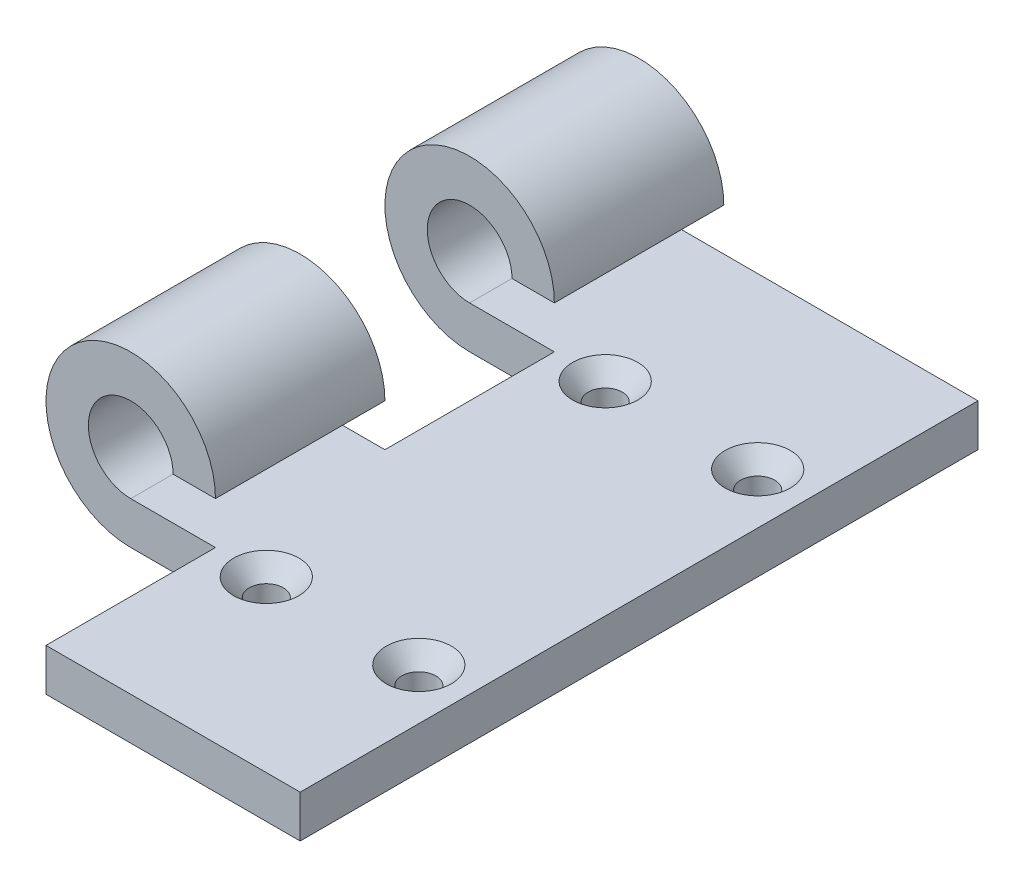
ISO-10303-21;
HEADER;
FILE_DESCRIPTION(('STEP AP214'),'2;1');
FILE_NAME('part.step','',(''),(''),'','','');
FILE_SCHEMA(('AUTOMOTIVE_DESIGN { 1 0 10303 214 1 1 1 1 }'));
ENDSEC;
DATA;
#1=APPLICATION_CONTEXT('core data for automotive mechanical design processes');
#2=APPLICATION_PROTOCOL_DEFINITION('international standard','automotive_design',2000,#1);
#3=PRODUCT_CONTEXT('',#1,'mechanical');
#4=PRODUCT('Part','Part','',(#3));
#5=PRODUCT_RELATED_PRODUCT_CATEGORY('part','',(#4));
#6=PRODUCT_DEFINITION_FORMATION('','',#4);
#7=PRODUCT_DEFINITION_CONTEXT('part definition',#1,'design');
#8=PRODUCT_DEFINITION('design','',#6,#7);
#9=PRODUCT_DEFINITION_SHAPE('','',#8);
#10=(LENGTH_UNIT() NAMED_UNIT(*) SI_UNIT(.MILLI.,.METRE.));
#11=(NAMED_UNIT(*) PLANE_ANGLE_UNIT() SI_UNIT($,.RADIAN.));
#12=(NAMED_UNIT(*) SI_UNIT($,.STERADIAN.) SOLID_ANGLE_UNIT());
#13=UNCERTAINTY_MEASURE_WITH_UNIT(LENGTH_MEASURE(1.E-05),#10,'distance_accuracy_value','');
#14=(GEOMETRIC_REPRESENTATION_CONTEXT(3) GLOBAL_UNCERTAINTY_ASSIGNED_CONTEXT((#13)) GLOBAL_UNIT_ASSIGNED_CONTEXT((#10,
#11,#12)) REPRESENTATION_CONTEXT('',''));
#15=CARTESIAN_POINT('',(0.,0.,0.));
#16=DIRECTION('',(0.,0.,1.));
#17=DIRECTION('',(1.,0.,0.));
#18=AXIS2_PLACEMENT_3D('',#15,#16,#17);
#19=CARTESIAN_POINT('',(-7.62,6.35,25.4));
#20=DIRECTION('',(0.,1.,0.));
#21=DIRECTION('',(0.,0.,1.));
#22=AXIS2_PLACEMENT_3D('',#19,#20,#21);
#23=CONICAL_SURFACE('',#22,4.8895,0.715584993317677);
#24=CARTESIAN_POINT('',(-7.62,3.66181910600595,25.4));
#25=DIRECTION('',(0.,1.,0.));
#26=DIRECTION('',(0.,0.,1.));
#27=AXIS2_PLACEMENT_3D('',#24,#25,#26);
#28=CIRCLE('',#27,2.5527);
#29=CARTESIAN_POINT('',(-7.62,3.66181910600595,27.9527));
#30=VERTEX_POINT('',#29);
#31=EDGE_CURVE('E11',#30,#30,#28,.T.);
#32=ORIENTED_EDGE('',*,*,#31,.F.);
#33=EDGE_LOOP('',(#32));
#34=FACE_BOUND('',#33,.T.);
#35=CARTESIAN_POINT('',(-7.62,6.35,25.4));
#36=DIRECTION('',(0.,1.,0.));
#37=DIRECTION('',(0.,0.,1.));
#38=AXIS2_PLACEMENT_3D('',#35,#36,#37);
#39=CIRCLE('',#38,4.8895);
#40=CARTESIAN_POINT('',(-7.62,6.35,30.2895));
#41=VERTEX_POINT('',#40);
#42=EDGE_CURVE('E315',#41,#41,#39,.T.);
#43=ORIENTED_EDGE('',*,*,#42,.T.);
#44=EDGE_LOOP('',(#43));
#45=FACE_BOUND('',#44,.T.);
#46=ADVANCED_FACE('F45',(#34,#45),#23,.F.);
#47=CARTESIAN_POINT('',(-7.62,6.35,25.4));
#48=DIRECTION('',(0.,1.,0.));
#49=DIRECTION('',(0.,0.,1.));
#50=AXIS2_PLACEMENT_3D('',#47,#48,#49);
#51=CYLINDRICAL_SURFACE('',#50,2.5527);
#52=CARTESIAN_POINT('',(-7.62,0.,25.4));
#53=DIRECTION('',(0.,1.,0.));
#54=DIRECTION('',(0.,0.,1.));
#55=AXIS2_PLACEMENT_3D('',#52,#53,#54);
#56=CIRCLE('',#55,2.5527);
#57=CARTESIAN_POINT('',(-7.62,0.,27.9527));
#58=VERTEX_POINT('',#57);
#59=EDGE_CURVE('E53',#58,#58,#56,.T.);
#60=ORIENTED_EDGE('',*,*,#59,.F.);
#61=EDGE_LOOP('',(#60));
#62=FACE_BOUND('',#61,.T.);
#63=ORIENTED_EDGE('',*,*,#31,.T.);
#64=EDGE_LOOP('',(#63));
#65=FACE_BOUND('',#64,.T.);
#66=ADVANCED_FACE('F323',(#62,#65),#51,.F.);
#67=CARTESIAN_POINT('',(-7.62,6.35,-25.4));
#68=DIRECTION('',(0.,1.,0.));
#69=DIRECTION('',(0.,0.,1.));
#70=AXIS2_PLACEMENT_3D('',#67,#68,#69);
#71=CONICAL_SURFACE('',#70,4.8895,0.715584993317677);
#72=CARTESIAN_POINT('',(-7.62,3.66181910600595,-25.4));
#73=DIRECTION('',(0.,1.,0.));
#74=DIRECTION('',(0.,0.,1.));
#75=AXIS2_PLACEMENT_3D('',#72,#73,#74);
#76=CIRCLE('',#75,2.5527);
#77=CARTESIAN_POINT('',(-7.62,3.66181910600595,-22.8473));
#78=VERTEX_POINT('',#77);
#79=EDGE_CURVE('E311',#78,#78,#76,.T.);
#80=ORIENTED_EDGE('',*,*,#79,.F.);
#81=EDGE_LOOP('',(#80));
#82=FACE_BOUND('',#81,.T.);
#83=CARTESIAN_POINT('',(-7.62,6.35,-25.4));
#84=DIRECTION('',(0.,1.,0.));
#85=DIRECTION('',(0.,0.,1.));
#86=AXIS2_PLACEMENT_3D('',#83,#84,#85);
#87=CIRCLE('',#86,4.8895);
#88=CARTESIAN_POINT('',(-7.62,6.35,-20.5105));
#89=VERTEX_POINT('',#88);
#90=EDGE_CURVE('E303',#89,#89,#87,.T.);
#91=ORIENTED_EDGE('',*,*,#90,.T.);
#92=EDGE_LOOP('',(#91));
#93=FACE_BOUND('',#92,.T.);
#94=ADVANCED_FACE('F326',(#82,#93),#71,.F.);
#95=CARTESIAN_POINT('',(-7.62,6.35,-25.4));
#96=DIRECTION('',(0.,1.,0.));
#97=DIRECTION('',(0.,0.,1.));
#98=AXIS2_PLACEMENT_3D('',#95,#96,#97);
#99=CYLINDRICAL_SURFACE('',#98,2.5527);
#100=CARTESIAN_POINT('',(-7.62,0.,-25.4));
#101=DIRECTION('',(0.,1.,0.));
#102=DIRECTION('',(0.,0.,1.));
#103=AXIS2_PLACEMENT_3D('',#100,#101,#102);
#104=CIRCLE('',#103,2.5527);
#105=CARTESIAN_POINT('',(-7.62,0.,-22.8473));
#106=VERTEX_POINT('',#105);
#107=EDGE_CURVE('E307',#106,#106,#104,.T.);
#108=ORIENTED_EDGE('',*,*,#107,.F.);
#109=EDGE_LOOP('',(#108));
#110=FACE_BOUND('',#109,.T.);
#111=ORIENTED_EDGE('',*,*,#79,.T.);
#112=EDGE_LOOP('',(#111));
#113=FACE_BOUND('',#112,.T.);
#114=ADVANCED_FACE('F371',(#110,#113),#99,.F.);
#115=CARTESIAN_POINT('',(-50.8,12.7,50.8));
#116=DIRECTION('',(0.,0.,-1.));
#117=DIRECTION('',(-1.,0.,0.));
#118=AXIS2_PLACEMENT_3D('',#115,#116,#117);
#119=CYLINDRICAL_SURFACE('',#118,6.34999999999999);
#120=DIRECTION('',(0.,0.,-1.));
#121=VECTOR('',#120,1.);
#122=CARTESIAN_POINT('',(-50.8,6.35,50.8));
#123=LINE('',#122,#121);
#124=CARTESIAN_POINT('',(-50.8,6.35,25.4));
#125=VERTEX_POINT('',#124);
#126=CARTESIAN_POINT('',(-50.8,6.35,0.));
#127=VERTEX_POINT('',#126);
#128=EDGE_CURVE('E266',#125,#127,#123,.T.);
#129=ORIENTED_EDGE('',*,*,#128,.T.);
#130=CARTESIAN_POINT('',(-50.8,12.7,0.));
#131=DIRECTION('',(0.,0.,1.));
#132=DIRECTION('',(1.,0.,0.));
#133=AXIS2_PLACEMENT_3D('',#130,#131,#132);
#134=CIRCLE('',#133,6.34999999999999);
#135=CARTESIAN_POINT('',(-44.45,12.7,0.));
#136=VERTEX_POINT('',#135);
#137=EDGE_CURVE('E191',#127,#136,#134,.F.);
#138=ORIENTED_EDGE('',*,*,#137,.T.);
#139=DIRECTION('',(0.,0.,-1.));
#140=VECTOR('',#139,1.);
#141=CARTESIAN_POINT('',(-44.45,12.7,50.8));
#142=LINE('',#141,#140);
#143=CARTESIAN_POINT('',(-44.45,12.7,25.4));
#144=VERTEX_POINT('',#143);
#145=EDGE_CURVE('E286',#144,#136,#142,.T.);
#146=ORIENTED_EDGE('',*,*,#145,.F.);
#147=CARTESIAN_POINT('',(-50.8,12.7,25.4));
#148=DIRECTION('',(0.,0.,-1.));
#149=DIRECTION('',(-1.,0.,0.));
#150=AXIS2_PLACEMENT_3D('',#147,#148,#149);
#151=CIRCLE('',#150,6.34999999999999);
#152=EDGE_CURVE('E218',#144,#125,#151,.F.);
#153=ORIENTED_EDGE('',*,*,#152,.T.);
#154=EDGE_LOOP('',(#129,#138,#146,#153));
#155=FACE_BOUND('',#154,.T.);
#156=ADVANCED_FACE('F370',(#155),#119,.F.);
#157=CARTESIAN_POINT('',(-38.1,12.7,50.8));
#158=DIRECTION('',(0.,-1.,0.));
#159=DIRECTION('',(1.,0.,0.));
#160=AXIS2_PLACEMENT_3D('',#157,#158,#159);
#161=PLANE('',#160);
#162=DIRECTION('',(-1.,0.,0.));
#163=VECTOR('',#162,1.);
#164=CARTESIAN_POINT('',(-38.1,12.7,0.));
#165=LINE('',#164,#163);
#166=CARTESIAN_POINT('',(-38.1,12.7,0.));
#167=VERTEX_POINT('',#166);
#168=EDGE_CURVE('E195',#167,#136,#165,.T.);
#169=ORIENTED_EDGE('',*,*,#168,.F.);
#170=DIRECTION('',(0.,0.,-1.));
#171=VECTOR('',#170,1.);
#172=CARTESIAN_POINT('',(-38.1,12.7,50.8));
#173=LINE('',#172,#171);
#174=CARTESIAN_POINT('',(-38.1,12.7,25.4));
#175=VERTEX_POINT('',#174);
#176=EDGE_CURVE('E281',#175,#167,#173,.T.);
#177=ORIENTED_EDGE('',*,*,#176,.F.);
#178=DIRECTION('',(1.,0.,0.));
#179=VECTOR('',#178,1.);
#180=CARTESIAN_POINT('',(-38.1,12.7,25.4));
#181=LINE('',#180,#179);
#182=EDGE_CURVE('E222',#144,#175,#181,.T.);
#183=ORIENTED_EDGE('',*,*,#182,.F.);
#184=ORIENTED_EDGE('',*,*,#145,.T.);
#185=EDGE_LOOP('',(#169,#177,#183,#184));
#186=FACE_BOUND('',#185,.T.);
#187=ADVANCED_FACE('F366',(#186),#161,.T.);
#188=CARTESIAN_POINT('',(-50.8,12.7,50.8));
#189=DIRECTION('',(0.,0.,-1.));
#190=DIRECTION('',(-1.,0.,0.));
#191=AXIS2_PLACEMENT_3D('',#188,#189,#190);
#192=CYLINDRICAL_SURFACE('',#191,12.7);
#193=CARTESIAN_POINT('',(-50.8,12.7,-25.4));
#194=DIRECTION('',(0.,0.,-1.));
#195=DIRECTION('',(-1.,0.,0.));
#196=AXIS2_PLACEMENT_3D('',#193,#194,#195);
#197=CIRCLE('',#196,12.7);
#198=CARTESIAN_POINT('',(-38.1,12.7,-25.4));
#199=VERTEX_POINT('',#198);
#200=CARTESIAN_POINT('',(-50.8,0.,-25.4));
#201=VERTEX_POINT('',#200);
#202=EDGE_CURVE('E161',#199,#201,#197,.F.);
#203=ORIENTED_EDGE('',*,*,#202,.F.);
#204=CARTESIAN_POINT('',(-38.1,12.7,-50.8));
#205=VERTEX_POINT('',#204);
#206=EDGE_CURVE('E280',#199,#205,#173,.T.);
#207=ORIENTED_EDGE('',*,*,#206,.T.);
#208=CARTESIAN_POINT('',(-50.8,12.7,-50.8));
#209=DIRECTION('',(0.,0.,-1.));
#210=DIRECTION('',(-1.,0.,0.));
#211=AXIS2_PLACEMENT_3D('',#208,#209,#210);
#212=CIRCLE('',#211,12.7);
#213=CARTESIAN_POINT('',(-50.8,0.,-50.8));
#214=VERTEX_POINT('',#213);
#215=EDGE_CURVE('E251',#214,#205,#212,.T.);
#216=ORIENTED_EDGE('',*,*,#215,.F.);
#217=DIRECTION('',(0.,0.,-1.));
#218=VECTOR('',#217,1.);
#219=CARTESIAN_POINT('',(-50.8,0.,50.8));
#220=LINE('',#219,#218);
#221=EDGE_CURVE('E276',#201,#214,#220,.T.);
#222=ORIENTED_EDGE('',*,*,#221,.F.);
#223=EDGE_LOOP('',(#203,#207,#216,#222));
#224=FACE_BOUND('',#223,.T.);
#225=ADVANCED_FACE('F361',(#224),#192,.T.);
#226=CARTESIAN_POINT('',(-44.45,12.7,-25.4));
#227=VERTEX_POINT('',#226);
#228=CARTESIAN_POINT('',(-44.45,12.7,-50.8));
#229=VERTEX_POINT('',#228);
#230=EDGE_CURVE('E285',#227,#229,#142,.T.);
#231=ORIENTED_EDGE('',*,*,#230,.F.);
#232=CARTESIAN_POINT('',(-50.8,12.7,-25.4));
#233=DIRECTION('',(0.,0.,-1.));
#234=DIRECTION('',(-1.,0.,0.));
#235=AXIS2_PLACEMENT_3D('',#232,#233,#234);
#236=CIRCLE('',#235,6.34999999999999);
#237=CARTESIAN_POINT('',(-50.8,6.35,-25.4));
#238=VERTEX_POINT('',#237);
#239=EDGE_CURVE('E181',#227,#238,#236,.F.);
#240=ORIENTED_EDGE('',*,*,#239,.T.);
#241=CARTESIAN_POINT('',(-50.8,6.35,-50.8));
#242=VERTEX_POINT('',#241);
#243=EDGE_CURVE('E243',#238,#242,#123,.T.);
#244=ORIENTED_EDGE('',*,*,#243,.T.);
#245=CARTESIAN_POINT('',(-50.8,12.7,-50.8));
#246=DIRECTION('',(0.,0.,1.));
#247=DIRECTION('',(1.,0.,0.));
#248=AXIS2_PLACEMENT_3D('',#245,#246,#247);
#249=CIRCLE('',#248,6.34999999999999);
#250=EDGE_CURVE('E229',#242,#229,#249,.F.);
#251=ORIENTED_EDGE('',*,*,#250,.T.);
#252=EDGE_LOOP('',(#231,#240,#244,#251));
#253=FACE_BOUND('',#252,.T.);
#254=ADVANCED_FACE('F364',(#253),#119,.F.);
#255=DIRECTION('',(1.,0.,0.));
#256=VECTOR('',#255,1.);
#257=CARTESIAN_POINT('',(-38.1,12.7,-25.4));
#258=LINE('',#257,#256);
#259=EDGE_CURVE('E186',#227,#199,#258,.T.);
#260=ORIENTED_EDGE('',*,*,#259,.F.);
#261=ORIENTED_EDGE('',*,*,#230,.T.);
#262=DIRECTION('',(-1.,0.,0.));
#263=VECTOR('',#262,1.);
#264=CARTESIAN_POINT('',(-38.1,12.7,-50.8));
#265=LINE('',#264,#263);
#266=EDGE_CURVE('E247',#205,#229,#265,.T.);
#267=ORIENTED_EDGE('',*,*,#266,.F.);
#268=ORIENTED_EDGE('',*,*,#206,.F.);
#269=EDGE_LOOP('',(#260,#261,#267,#268));
#270=FACE_BOUND('',#269,.T.);
#271=ADVANCED_FACE('F359',(#270),#161,.T.);
#272=CARTESIAN_POINT('',(-50.8,12.7,0.));
#273=DIRECTION('',(0.,0.,1.));
#274=DIRECTION('',(1.,0.,0.));
#275=AXIS2_PLACEMENT_3D('',#272,#273,#274);
#276=CIRCLE('',#275,12.7);
#277=CARTESIAN_POINT('',(-50.8,0.,0.));
#278=VERTEX_POINT('',#277);
#279=EDGE_CURVE('E198',#278,#167,#276,.F.);
#280=ORIENTED_EDGE('',*,*,#279,.F.);
#281=CARTESIAN_POINT('',(-50.8,0.,25.4));
#282=VERTEX_POINT('',#281);
#283=EDGE_CURVE('E277',#282,#278,#220,.T.);
#284=ORIENTED_EDGE('',*,*,#283,.F.);
#285=CARTESIAN_POINT('',(-50.8,12.7,25.4));
#286=DIRECTION('',(0.,0.,-1.));
#287=DIRECTION('',(-1.,0.,0.));
#288=AXIS2_PLACEMENT_3D('',#285,#286,#287);
#289=CIRCLE('',#288,12.7);
#290=EDGE_CURVE('E226',#175,#282,#289,.F.);
#291=ORIENTED_EDGE('',*,*,#290,.F.);
#292=ORIENTED_EDGE('',*,*,#176,.T.);
#293=EDGE_LOOP('',(#280,#284,#291,#292));
#294=FACE_BOUND('',#293,.T.);
#295=ADVANCED_FACE('F355',(#294),#192,.T.);
#296=CARTESIAN_POINT('',(0.,0.,50.8));
#297=DIRECTION('',(0.,-1.,0.));
#298=DIRECTION('',(0.,0.,-1.));
#299=AXIS2_PLACEMENT_3D('',#296,#297,#298);
#300=PLANE('',#299);
#301=CARTESIAN_POINT('',(-30.48,0.,25.4));
#302=DIRECTION('',(0.,1.,0.));
#303=DIRECTION('',(0.,0.,1.));
#304=AXIS2_PLACEMENT_3D('',#301,#302,#303);
#305=CIRCLE('',#304,2.5527);
#306=CARTESIAN_POINT('',(-30.48,0.,27.9527));
#307=VERTEX_POINT('',#306);
#308=EDGE_CURVE('E549',#307,#307,#305,.T.);
#309=ORIENTED_EDGE('',*,*,#308,.T.);
#310=EDGE_LOOP('',(#309));
#311=FACE_BOUND('',#310,.T.);
#312=CARTESIAN_POINT('',(-30.48,0.,-25.4));
#313=DIRECTION('',(0.,1.,0.));
#314=DIRECTION('',(0.,0.,1.));
#315=AXIS2_PLACEMENT_3D('',#312,#313,#314);
#316=CIRCLE('',#315,2.5527);
#317=CARTESIAN_POINT('',(-30.48,0.,-22.8473));
#318=VERTEX_POINT('',#317);
#319=EDGE_CURVE('E170',#318,#318,#316,.T.);
#320=ORIENTED_EDGE('',*,*,#319,.T.);
#321=EDGE_LOOP('',(#320));
#322=FACE_BOUND('',#321,.T.);
#323=DIRECTION('',(1.,0.,0.));
#324=VECTOR('',#323,1.);
#325=CARTESIAN_POINT('',(-38.1,0.,0.));
#326=LINE('',#325,#324);
#327=CARTESIAN_POINT('',(-38.1,0.,0.));
#328=VERTEX_POINT('',#327);
#329=EDGE_CURVE('E155',#278,#328,#326,.T.);
#330=ORIENTED_EDGE('',*,*,#329,.T.);
#331=DIRECTION('',(0.,0.,-1.));
#332=VECTOR('',#331,1.);
#333=CARTESIAN_POINT('',(-38.1,0.,0.));
#334=LINE('',#333,#332);
#335=CARTESIAN_POINT('',(-38.1,0.,-25.4));
#336=VERTEX_POINT('',#335);
#337=EDGE_CURVE('E148',#328,#336,#334,.T.);
#338=ORIENTED_EDGE('',*,*,#337,.T.);
#339=DIRECTION('',(-1.,0.,0.));
#340=VECTOR('',#339,1.);
#341=CARTESIAN_POINT('',(-38.1,0.,-25.4));
#342=LINE('',#341,#340);
#343=EDGE_CURVE('E158',#336,#201,#342,.T.);
#344=ORIENTED_EDGE('',*,*,#343,.T.);
#345=ORIENTED_EDGE('',*,*,#221,.T.);
#346=DIRECTION('',(-1.,0.,0.));
#347=VECTOR('',#346,1.);
#348=CARTESIAN_POINT('',(0.,0.,-50.8));
#349=LINE('',#348,#347);
#350=CARTESIAN_POINT('',(0.,0.,-50.8));
#351=VERTEX_POINT('',#350);
#352=EDGE_CURVE('E255',#351,#214,#349,.T.);
#353=ORIENTED_EDGE('',*,*,#352,.F.);
#354=DIRECTION('',(0.,0.,-1.));
#355=VECTOR('',#354,1.);
#356=CARTESIAN_POINT('',(0.,0.,50.8));
#357=LINE('',#356,#355);
#358=CARTESIAN_POINT('',(0.,0.,50.8));
#359=VERTEX_POINT('',#358);
#360=EDGE_CURVE('E273',#359,#351,#357,.T.);
#361=ORIENTED_EDGE('',*,*,#360,.F.);
#362=DIRECTION('',(-1.,0.,0.));
#363=VECTOR('',#362,1.);
#364=CARTESIAN_POINT('',(0.,0.,50.8));
#365=LINE('',#364,#363);
#366=CARTESIAN_POINT('',(-38.1,0.,50.8));
#367=VERTEX_POINT('',#366);
#368=EDGE_CURVE('E230',#359,#367,#365,.T.);
#369=ORIENTED_EDGE('',*,*,#368,.T.);
#370=DIRECTION('',(0.,0.,-1.));
#371=VECTOR('',#370,1.);
#372=CARTESIAN_POINT('',(-38.1,0.,50.8));
#373=LINE('',#372,#371);
#374=CARTESIAN_POINT('',(-38.1,0.,25.4));
#375=VERTEX_POINT('',#374);
#376=EDGE_CURVE('E68',#367,#375,#373,.T.);
#377=ORIENTED_EDGE('',*,*,#376,.T.);
#378=DIRECTION('',(-1.,0.,0.));
#379=VECTOR('',#378,1.);
#380=CARTESIAN_POINT('',(-38.1,0.,25.4));
#381=LINE('',#380,#379);
#382=EDGE_CURVE('E203',#375,#282,#381,.T.);
#383=ORIENTED_EDGE('',*,*,#382,.T.);
#384=ORIENTED_EDGE('',*,*,#283,.T.);
#385=EDGE_LOOP('',(#330,#338,#344,#345,#353,#361,#369,#377,#383,#384));
#386=FACE_BOUND('',#385,.T.);
#387=ORIENTED_EDGE('',*,*,#107,.T.);
#388=EDGE_LOOP('',(#387));
#389=FACE_BOUND('',#388,.T.);
#390=ORIENTED_EDGE('',*,*,#59,.T.);
#391=EDGE_LOOP('',(#390));
#392=FACE_BOUND('',#391,.T.);
#393=ADVANCED_FACE('F166',(#311,#322,#386,#389,#392),#300,.T.);
#394=CARTESIAN_POINT('',(0.,6.35,50.8));
#395=DIRECTION('',(1.,0.,0.));
#396=DIRECTION('',(0.,0.,-1.));
#397=AXIS2_PLACEMENT_3D('',#394,#395,#396);
#398=PLANE('',#397);
#399=DIRECTION('',(0.,-1.,0.));
#400=VECTOR('',#399,1.);
#401=CARTESIAN_POINT('',(0.,6.35,-50.8));
#402=LINE('',#401,#400);
#403=CARTESIAN_POINT('',(0.,6.35,-50.8));
#404=VERTEX_POINT('',#403);
#405=EDGE_CURVE('E259',#404,#351,#402,.T.);
#406=ORIENTED_EDGE('',*,*,#405,.F.);
#407=DIRECTION('',(0.,0.,-1.));
#408=VECTOR('',#407,1.);
#409=CARTESIAN_POINT('',(0.,6.35,50.8));
#410=LINE('',#409,#408);
#411=CARTESIAN_POINT('',(0.,6.35,50.8));
#412=VERTEX_POINT('',#411);
#413=EDGE_CURVE('E270',#412,#404,#410,.T.);
#414=ORIENTED_EDGE('',*,*,#413,.F.);
#415=DIRECTION('',(0.,-1.,0.));
#416=VECTOR('',#415,1.);
#417=CARTESIAN_POINT('',(0.,6.35,50.8));
#418=LINE('',#417,#416);
#419=EDGE_CURVE('E234',#412,#359,#418,.T.);
#420=ORIENTED_EDGE('',*,*,#419,.T.);
#421=ORIENTED_EDGE('',*,*,#360,.T.);
#422=EDGE_LOOP('',(#406,#414,#420,#421));
#423=FACE_BOUND('',#422,.T.);
#424=ADVANCED_FACE('F336',(#423),#398,.T.);
#425=CARTESIAN_POINT('',(0.,6.35,50.8));
#426=DIRECTION('',(0.,-1.,0.));
#427=DIRECTION('',(0.,0.,-1.));
#428=AXIS2_PLACEMENT_3D('',#425,#426,#427);
#429=PLANE('',#428);
#430=CARTESIAN_POINT('',(-30.48,6.35,25.4));
#431=DIRECTION('',(0.,1.,0.));
#432=DIRECTION('',(0.,0.,1.));
#433=AXIS2_PLACEMENT_3D('',#430,#431,#432);
#434=CIRCLE('',#433,4.8895);
#435=CARTESIAN_POINT('',(-30.48,6.35,30.2895));
#436=VERTEX_POINT('',#435);
#437=EDGE_CURVE('E560',#436,#436,#434,.T.);
#438=ORIENTED_EDGE('',*,*,#437,.F.);
#439=EDGE_LOOP('',(#438));
#440=FACE_BOUND('',#439,.T.);
#441=CARTESIAN_POINT('',(-30.48,6.35,-25.4));
#442=DIRECTION('',(0.,1.,0.));
#443=DIRECTION('',(0.,0.,1.));
#444=AXIS2_PLACEMENT_3D('',#441,#442,#443);
#445=CIRCLE('',#444,4.8895);
#446=CARTESIAN_POINT('',(-30.48,6.35,-20.5105));
#447=VERTEX_POINT('',#446);
#448=EDGE_CURVE('E554',#447,#447,#445,.T.);
#449=ORIENTED_EDGE('',*,*,#448,.F.);
#450=EDGE_LOOP('',(#449));
#451=FACE_BOUND('',#450,.T.);
#452=DIRECTION('',(0.,0.,1.));
#453=VECTOR('',#452,1.);
#454=CARTESIAN_POINT('',(-38.1,6.35,50.8));
#455=LINE('',#454,#453);
#456=CARTESIAN_POINT('',(-38.1,6.35,-25.4));
#457=VERTEX_POINT('',#456);
#458=CARTESIAN_POINT('',(-38.1,6.35,0.));
#459=VERTEX_POINT('',#458);
#460=EDGE_CURVE('E151',#457,#459,#455,.T.);
#461=ORIENTED_EDGE('',*,*,#460,.T.);
#462=DIRECTION('',(-1.,0.,0.));
#463=VECTOR('',#462,1.);
#464=CARTESIAN_POINT('',(0.,6.35,0.));
#465=LINE('',#464,#463);
#466=EDGE_CURVE('E299',#459,#127,#465,.T.);
#467=ORIENTED_EDGE('',*,*,#466,.T.);
#468=ORIENTED_EDGE('',*,*,#128,.F.);
#469=DIRECTION('',(1.,0.,0.));
#470=VECTOR('',#469,1.);
#471=CARTESIAN_POINT('',(0.,6.35,25.4));
#472=LINE('',#471,#470);
#473=CARTESIAN_POINT('',(-38.1,6.35,25.4));
#474=VERTEX_POINT('',#473);
#475=EDGE_CURVE('E290',#125,#474,#472,.T.);
#476=ORIENTED_EDGE('',*,*,#475,.T.);
#477=DIRECTION('',(0.,0.,1.));
#478=VECTOR('',#477,1.);
#479=CARTESIAN_POINT('',(-38.1,6.35,50.8));
#480=LINE('',#479,#478);
#481=CARTESIAN_POINT('',(-38.1,6.35,50.8));
#482=VERTEX_POINT('',#481);
#483=EDGE_CURVE('E211',#474,#482,#480,.T.);
#484=ORIENTED_EDGE('',*,*,#483,.T.);
#485=DIRECTION('',(1.,0.,0.));
#486=VECTOR('',#485,1.);
#487=CARTESIAN_POINT('',(0.,6.35,50.8));
#488=LINE('',#487,#486);
#489=EDGE_CURVE('E239',#412,#482,#488,.F.);
#490=ORIENTED_EDGE('',*,*,#489,.F.);
#491=ORIENTED_EDGE('',*,*,#413,.T.);
#492=DIRECTION('',(1.,0.,0.));
#493=VECTOR('',#492,1.);
#494=CARTESIAN_POINT('',(0.,6.35,-50.8));
#495=LINE('',#494,#493);
#496=EDGE_CURVE('E235',#404,#242,#495,.F.);
#497=ORIENTED_EDGE('',*,*,#496,.T.);
#498=ORIENTED_EDGE('',*,*,#243,.F.);
#499=DIRECTION('',(1.,0.,0.));
#500=VECTOR('',#499,1.);
#501=CARTESIAN_POINT('',(0.,6.35,-25.4));
#502=LINE('',#501,#500);
#503=EDGE_CURVE('E294',#238,#457,#502,.T.);
#504=ORIENTED_EDGE('',*,*,#503,.T.);
#505=EDGE_LOOP('',(#461,#467,#468,#476,#484,#490,#491,#497,#498,#504));
#506=FACE_BOUND('',#505,.T.);
#507=ORIENTED_EDGE('',*,*,#90,.F.);
#508=EDGE_LOOP('',(#507));
#509=FACE_BOUND('',#508,.T.);
#510=ORIENTED_EDGE('',*,*,#42,.F.);
#511=EDGE_LOOP('',(#510));
#512=FACE_BOUND('',#511,.T.);
#513=ADVANCED_FACE('F333',(#440,#451,#506,#509,#512),#429,.F.);
#514=CARTESIAN_POINT('',(-50.8,12.7,50.8));
#515=DIRECTION('',(0.,0.,1.));
#516=DIRECTION('',(1.,0.,0.));
#517=AXIS2_PLACEMENT_3D('',#514,#515,#516);
#518=PLANE('',#517);
#519=DIRECTION('',(0.,1.,0.));
#520=VECTOR('',#519,1.);
#521=CARTESIAN_POINT('',(-38.1,0.,50.8));
#522=LINE('',#521,#520);
#523=EDGE_CURVE('E208',#367,#482,#522,.T.);
#524=ORIENTED_EDGE('',*,*,#523,.F.);
#525=ORIENTED_EDGE('',*,*,#368,.F.);
#526=ORIENTED_EDGE('',*,*,#419,.F.);
#527=ORIENTED_EDGE('',*,*,#489,.T.);
#528=EDGE_LOOP('',(#524,#525,#526,#527));
#529=FACE_BOUND('',#528,.T.);
#530=ADVANCED_FACE('F335',(#529),#518,.T.);
#531=CARTESIAN_POINT('',(-50.8,12.7,-50.8));
#532=DIRECTION('',(0.,0.,1.));
#533=DIRECTION('',(1.,0.,0.));
#534=AXIS2_PLACEMENT_3D('',#531,#532,#533);
#535=PLANE('',#534);
#536=ORIENTED_EDGE('',*,*,#250,.F.);
#537=ORIENTED_EDGE('',*,*,#496,.F.);
#538=ORIENTED_EDGE('',*,*,#405,.T.);
#539=ORIENTED_EDGE('',*,*,#352,.T.);
#540=ORIENTED_EDGE('',*,*,#215,.T.);
#541=ORIENTED_EDGE('',*,*,#266,.T.);
#542=EDGE_LOOP('',(#536,#537,#538,#539,#540,#541));
#543=FACE_BOUND('',#542,.T.);
#544=ADVANCED_FACE('F344',(#543),#535,.F.);
#545=CARTESIAN_POINT('',(-38.1,0.,50.8));
#546=DIRECTION('',(1.,0.,0.));
#547=DIRECTION('',(0.,0.,-1.));
#548=AXIS2_PLACEMENT_3D('',#545,#546,#547);
#549=PLANE('',#548);
#550=DIRECTION('',(0.,1.,0.));
#551=VECTOR('',#550,1.);
#552=CARTESIAN_POINT('',(-38.1,0.,25.4));
#553=LINE('',#552,#551);
#554=EDGE_CURVE('E207',#375,#474,#553,.T.);
#555=ORIENTED_EDGE('',*,*,#554,.F.);
#556=ORIENTED_EDGE('',*,*,#376,.F.);
#557=ORIENTED_EDGE('',*,*,#523,.T.);
#558=ORIENTED_EDGE('',*,*,#483,.F.);
#559=EDGE_LOOP('',(#555,#556,#557,#558));
#560=FACE_BOUND('',#559,.T.);
#561=ADVANCED_FACE('F429',(#560),#549,.F.);
#562=CARTESIAN_POINT('',(-38.1,0.,25.4));
#563=DIRECTION('',(0.,0.,-1.));
#564=DIRECTION('',(-1.,0.,0.));
#565=AXIS2_PLACEMENT_3D('',#562,#563,#564);
#566=PLANE('',#565);
#567=ORIENTED_EDGE('',*,*,#290,.T.);
#568=ORIENTED_EDGE('',*,*,#382,.F.);
#569=ORIENTED_EDGE('',*,*,#554,.T.);
#570=ORIENTED_EDGE('',*,*,#475,.F.);
#571=ORIENTED_EDGE('',*,*,#152,.F.);
#572=ORIENTED_EDGE('',*,*,#182,.T.);
#573=EDGE_LOOP('',(#567,#568,#569,#570,#571,#572));
#574=FACE_BOUND('',#573,.T.);
#575=ADVANCED_FACE('F437',(#574),#566,.F.);
#576=CARTESIAN_POINT('',(-38.1,0.,0.));
#577=DIRECTION('',(1.,0.,0.));
#578=DIRECTION('',(0.,0.,-1.));
#579=AXIS2_PLACEMENT_3D('',#576,#577,#578);
#580=PLANE('',#579);
#581=DIRECTION('',(0.,1.,0.));
#582=VECTOR('',#581,1.);
#583=CARTESIAN_POINT('',(-38.1,0.,-25.4));
#584=LINE('',#583,#582);
#585=EDGE_CURVE('E60',#336,#457,#584,.T.);
#586=ORIENTED_EDGE('',*,*,#585,.F.);
#587=ORIENTED_EDGE('',*,*,#337,.F.);
#588=DIRECTION('',(0.,1.,0.));
#589=VECTOR('',#588,1.);
#590=CARTESIAN_POINT('',(-38.1,0.,0.));
#591=LINE('',#590,#589);
#592=EDGE_CURVE('E154',#328,#459,#591,.T.);
#593=ORIENTED_EDGE('',*,*,#592,.T.);
#594=ORIENTED_EDGE('',*,*,#460,.F.);
#595=EDGE_LOOP('',(#586,#587,#593,#594));
#596=FACE_BOUND('',#595,.T.);
#597=ADVANCED_FACE('F145',(#596),#580,.F.);
#598=CARTESIAN_POINT('',(-38.1,0.,0.));
#599=DIRECTION('',(0.,0.,1.));
#600=DIRECTION('',(1.,0.,0.));
#601=AXIS2_PLACEMENT_3D('',#598,#599,#600);
#602=PLANE('',#601);
#603=ORIENTED_EDGE('',*,*,#279,.T.);
#604=ORIENTED_EDGE('',*,*,#168,.T.);
#605=ORIENTED_EDGE('',*,*,#137,.F.);
#606=ORIENTED_EDGE('',*,*,#466,.F.);
#607=ORIENTED_EDGE('',*,*,#592,.F.);
#608=ORIENTED_EDGE('',*,*,#329,.F.);
#609=EDGE_LOOP('',(#603,#604,#605,#606,#607,#608));
#610=FACE_BOUND('',#609,.T.);
#611=ADVANCED_FACE('F476',(#610),#602,.F.);
#612=CARTESIAN_POINT('',(-38.1,0.,-25.4));
#613=DIRECTION('',(0.,0.,-1.));
#614=DIRECTION('',(-1.,0.,0.));
#615=AXIS2_PLACEMENT_3D('',#612,#613,#614);
#616=PLANE('',#615);
#617=ORIENTED_EDGE('',*,*,#202,.T.);
#618=ORIENTED_EDGE('',*,*,#343,.F.);
#619=ORIENTED_EDGE('',*,*,#585,.T.);
#620=ORIENTED_EDGE('',*,*,#503,.F.);
#621=ORIENTED_EDGE('',*,*,#239,.F.);
#622=ORIENTED_EDGE('',*,*,#259,.T.);
#623=EDGE_LOOP('',(#617,#618,#619,#620,#621,#622));
#624=FACE_BOUND('',#623,.T.);
#625=ADVANCED_FACE('F159',(#624),#616,.F.);
#626=CARTESIAN_POINT('',(-30.48,6.35,-25.4));
#627=DIRECTION('',(0.,1.,0.));
#628=DIRECTION('',(0.,0.,1.));
#629=AXIS2_PLACEMENT_3D('',#626,#627,#628);
#630=CYLINDRICAL_SURFACE('',#629,2.5527);
#631=ORIENTED_EDGE('',*,*,#319,.F.);
#632=EDGE_LOOP('',(#631));
#633=FACE_BOUND('',#632,.T.);
#634=CARTESIAN_POINT('',(-30.48,3.66181910600595,-25.4));
#635=DIRECTION('',(0.,1.,0.));
#636=DIRECTION('',(0.,0.,1.));
#637=AXIS2_PLACEMENT_3D('',#634,#635,#636);
#638=CIRCLE('',#637,2.5527);
#639=CARTESIAN_POINT('',(-30.48,3.66181910600595,-22.8473));
#640=VERTEX_POINT('',#639);
#641=EDGE_CURVE('E174',#640,#640,#638,.T.);
#642=ORIENTED_EDGE('',*,*,#641,.T.);
#643=EDGE_LOOP('',(#642));
#644=FACE_BOUND('',#643,.T.);
#645=ADVANCED_FACE('F494',(#633,#644),#630,.F.);
#646=CARTESIAN_POINT('',(-30.48,6.35,-25.4));
#647=DIRECTION('',(0.,1.,0.));
#648=DIRECTION('',(0.,0.,1.));
#649=AXIS2_PLACEMENT_3D('',#646,#647,#648);
#650=CONICAL_SURFACE('',#649,4.8895,0.715584993317677);
#651=ORIENTED_EDGE('',*,*,#641,.F.);
#652=EDGE_LOOP('',(#651));
#653=FACE_BOUND('',#652,.T.);
#654=ORIENTED_EDGE('',*,*,#448,.T.);
#655=EDGE_LOOP('',(#654));
#656=FACE_BOUND('',#655,.T.);
#657=ADVANCED_FACE('F503',(#653,#656),#650,.F.);
#658=CARTESIAN_POINT('',(-30.48,6.35,25.4));
#659=DIRECTION('',(0.,1.,0.));
#660=DIRECTION('',(0.,0.,1.));
#661=AXIS2_PLACEMENT_3D('',#658,#659,#660);
#662=CYLINDRICAL_SURFACE('',#661,2.5527);
#663=ORIENTED_EDGE('',*,*,#308,.F.);
#664=EDGE_LOOP('',(#663));
#665=FACE_BOUND('',#664,.T.);
#666=CARTESIAN_POINT('',(-30.48,3.66181910600595,25.4));
#667=DIRECTION('',(0.,1.,0.));
#668=DIRECTION('',(0.,0.,1.));
#669=AXIS2_PLACEMENT_3D('',#666,#667,#668);
#670=CIRCLE('',#669,2.5527);
#671=CARTESIAN_POINT('',(-30.48,3.66181910600595,27.9527));
#672=VERTEX_POINT('',#671);
#673=EDGE_CURVE('E552',#672,#672,#670,.T.);
#674=ORIENTED_EDGE('',*,*,#673,.T.);
#675=EDGE_LOOP('',(#674));
#676=FACE_BOUND('',#675,.T.);
#677=ADVANCED_FACE('F513',(#665,#676),#662,.F.);
#678=CARTESIAN_POINT('',(-30.48,6.35,25.4));
#679=DIRECTION('',(0.,1.,0.));
#680=DIRECTION('',(0.,0.,1.));
#681=AXIS2_PLACEMENT_3D('',#678,#679,#680);
#682=CONICAL_SURFACE('',#681,4.8895,0.715584993317677);
#683=ORIENTED_EDGE('',*,*,#673,.F.);
#684=EDGE_LOOP('',(#683));
#685=FACE_BOUND('',#684,.T.);
#686=ORIENTED_EDGE('',*,*,#437,.T.);
#687=EDGE_LOOP('',(#686));
#688=FACE_BOUND('',#687,.T.);
#689=ADVANCED_FACE('F531',(#685,#688),#682,.F.);
#690=CLOSED_SHELL('',(#46,#66,#94,#114,#156,#187,#225,#254,#271,#295,#393,#424,#513,#530,#544,
#561,#575,#597,#611,#625,#645,#657,#677,#689));
#691=MANIFOLD_SOLID_BREP('B2',#690);
#692=ADVANCED_BREP_SHAPE_REPRESENTATION('',(#18,#691),#14);
#693=SHAPE_DEFINITION_REPRESENTATION(#9,#692);
ENDSEC;
END-ISO-10303-21;
